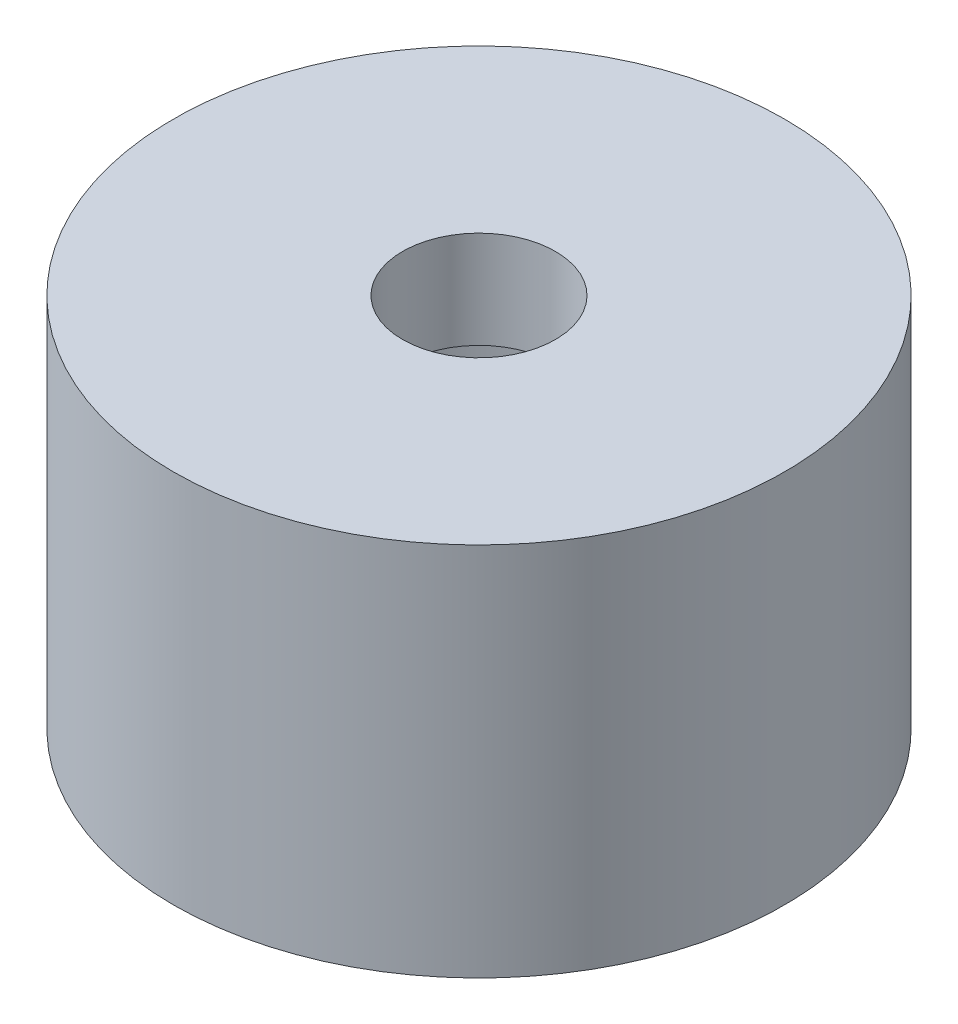
ISO-10303-21;
HEADER;
FILE_DESCRIPTION(('STEP AP214'),'2;1');
FILE_NAME('part.step','',(''),(''),'','','');
FILE_SCHEMA(('AUTOMOTIVE_DESIGN { 1 0 10303 214 1 1 1 1 }'));
ENDSEC;
DATA;
#1=APPLICATION_CONTEXT('core data for automotive mechanical design processes');
#2=APPLICATION_PROTOCOL_DEFINITION('international standard','automotive_design',2000,#1);
#3=PRODUCT_CONTEXT('',#1,'mechanical');
#4=PRODUCT('Part','Part','',(#3));
#5=PRODUCT_RELATED_PRODUCT_CATEGORY('part','',(#4));
#6=PRODUCT_DEFINITION_FORMATION('','',#4);
#7=PRODUCT_DEFINITION_CONTEXT('part definition',#1,'design');
#8=PRODUCT_DEFINITION('design','',#6,#7);
#9=PRODUCT_DEFINITION_SHAPE('','',#8);
#10=(LENGTH_UNIT() NAMED_UNIT(*) SI_UNIT(.MILLI.,.METRE.));
#11=(NAMED_UNIT(*) PLANE_ANGLE_UNIT() SI_UNIT($,.RADIAN.));
#12=(NAMED_UNIT(*) SI_UNIT($,.STERADIAN.) SOLID_ANGLE_UNIT());
#13=UNCERTAINTY_MEASURE_WITH_UNIT(LENGTH_MEASURE(1.E-05),#10,'distance_accuracy_value','');
#14=(GEOMETRIC_REPRESENTATION_CONTEXT(3) GLOBAL_UNCERTAINTY_ASSIGNED_CONTEXT((#13)) GLOBAL_UNIT_ASSIGNED_CONTEXT((#10,
#11,#12)) REPRESENTATION_CONTEXT('',''));
#15=CARTESIAN_POINT('',(0.,0.,0.));
#16=DIRECTION('',(0.,0.,1.));
#17=DIRECTION('',(1.,0.,0.));
#18=AXIS2_PLACEMENT_3D('',#15,#16,#17);
#19=CARTESIAN_POINT('',(0.,0.,0.));
#20=DIRECTION('',(0.,1.,0.));
#21=DIRECTION('',(0.,0.,1.));
#22=AXIS2_PLACEMENT_3D('',#19,#20,#21);
#23=PLANE('',#22);
#24=CARTESIAN_POINT('',(0.,0.,0.));
#25=DIRECTION('',(0.,1.,0.));
#26=DIRECTION('',(0.,0.,1.));
#27=AXIS2_PLACEMENT_3D('',#24,#25,#26);
#28=CIRCLE('',#27,11.);
#29=CARTESIAN_POINT('',(0.,0.,11.));
#30=VERTEX_POINT('',#29);
#31=EDGE_CURVE('E10',#30,#30,#28,.T.);
#32=ORIENTED_EDGE('',*,*,#31,.F.);
#33=EDGE_LOOP('',(#32));
#34=FACE_BOUND('',#33,.T.);
#35=CARTESIAN_POINT('',(0.,0.,0.));
#36=DIRECTION('',(0.,1.,0.));
#37=DIRECTION('',(0.,0.,1.));
#38=AXIS2_PLACEMENT_3D('',#35,#36,#37);
#39=CIRCLE('',#38,7.);
#40=CARTESIAN_POINT('',(0.,0.,7.));
#41=VERTEX_POINT('',#40);
#42=EDGE_CURVE('E38',#41,#41,#39,.T.);
#43=ORIENTED_EDGE('',*,*,#42,.T.);
#44=EDGE_LOOP('',(#43));
#45=FACE_BOUND('',#44,.T.);
#46=ADVANCED_FACE('F31',(#34,#45),#23,.F.);
#47=CARTESIAN_POINT('',(0.,10.,0.));
#48=DIRECTION('',(0.,-1.,0.));
#49=DIRECTION('',(0.,0.,-1.));
#50=AXIS2_PLACEMENT_3D('',#47,#48,#49);
#51=CYLINDRICAL_SURFACE('',#50,11.);
#52=ORIENTED_EDGE('',*,*,#31,.T.);
#53=EDGE_LOOP('',(#52));
#54=FACE_BOUND('',#53,.T.);
#55=CARTESIAN_POINT('',(0.,13.5,0.));
#56=DIRECTION('',(0.,1.,0.));
#57=DIRECTION('',(0.,0.,1.));
#58=AXIS2_PLACEMENT_3D('',#55,#56,#57);
#59=CIRCLE('',#58,11.);
#60=CARTESIAN_POINT('',(0.,13.5,11.));
#61=VERTEX_POINT('',#60);
#62=EDGE_CURVE('E46',#61,#61,#59,.T.);
#63=ORIENTED_EDGE('',*,*,#62,.F.);
#64=EDGE_LOOP('',(#63));
#65=FACE_BOUND('',#64,.T.);
#66=ADVANCED_FACE('F33',(#54,#65),#51,.T.);
#67=CARTESIAN_POINT('',(0.,10.,0.));
#68=DIRECTION('',(0.,-1.,0.));
#69=DIRECTION('',(0.,0.,-1.));
#70=AXIS2_PLACEMENT_3D('',#67,#68,#69);
#71=CYLINDRICAL_SURFACE('',#70,7.);
#72=CARTESIAN_POINT('',(0.,10.,0.));
#73=DIRECTION('',(0.,1.,0.));
#74=DIRECTION('',(0.,0.,1.));
#75=AXIS2_PLACEMENT_3D('',#72,#73,#74);
#76=CIRCLE('',#75,7.);
#77=CARTESIAN_POINT('',(0.,10.,7.));
#78=VERTEX_POINT('',#77);
#79=EDGE_CURVE('E42',#78,#78,#76,.T.);
#80=ORIENTED_EDGE('',*,*,#79,.T.);
#81=EDGE_LOOP('',(#80));
#82=FACE_BOUND('',#81,.T.);
#83=ORIENTED_EDGE('',*,*,#42,.F.);
#84=EDGE_LOOP('',(#83));
#85=FACE_BOUND('',#84,.T.);
#86=ADVANCED_FACE('F71',(#82,#85),#71,.F.);
#87=CARTESIAN_POINT('',(0.,10.,0.));
#88=DIRECTION('',(0.,1.,0.));
#89=DIRECTION('',(0.,0.,1.));
#90=AXIS2_PLACEMENT_3D('',#87,#88,#89);
#91=PLANE('',#90);
#92=CARTESIAN_POINT('',(0.,10.,0.));
#93=DIRECTION('',(0.,1.,0.));
#94=DIRECTION('',(0.,0.,1.));
#95=AXIS2_PLACEMENT_3D('',#92,#93,#94);
#96=CIRCLE('',#95,2.75);
#97=CARTESIAN_POINT('',(0.,10.,2.75));
#98=VERTEX_POINT('',#97);
#99=EDGE_CURVE('E52',#98,#98,#96,.T.);
#100=ORIENTED_EDGE('',*,*,#99,.T.);
#101=EDGE_LOOP('',(#100));
#102=FACE_BOUND('',#101,.T.);
#103=ORIENTED_EDGE('',*,*,#79,.F.);
#104=EDGE_LOOP('',(#103));
#105=FACE_BOUND('',#104,.T.);
#106=ADVANCED_FACE('F63',(#102,#105),#91,.F.);
#107=CARTESIAN_POINT('',(0.,13.5,0.));
#108=DIRECTION('',(0.,1.,0.));
#109=DIRECTION('',(0.,0.,1.));
#110=AXIS2_PLACEMENT_3D('',#107,#108,#109);
#111=PLANE('',#110);
#112=ORIENTED_EDGE('',*,*,#62,.T.);
#113=EDGE_LOOP('',(#112));
#114=FACE_BOUND('',#113,.T.);
#115=CARTESIAN_POINT('',(0.,13.5,0.));
#116=DIRECTION('',(0.,1.,0.));
#117=DIRECTION('',(0.,0.,1.));
#118=AXIS2_PLACEMENT_3D('',#115,#116,#117);
#119=CIRCLE('',#118,2.75);
#120=CARTESIAN_POINT('',(0.,13.5,2.75));
#121=VERTEX_POINT('',#120);
#122=EDGE_CURVE('E51',#121,#121,#119,.T.);
#123=ORIENTED_EDGE('',*,*,#122,.F.);
#124=EDGE_LOOP('',(#123));
#125=FACE_BOUND('',#124,.T.);
#126=ADVANCED_FACE('F61',(#114,#125),#111,.T.);
#127=CARTESIAN_POINT('',(0.,13.5,0.));
#128=DIRECTION('',(0.,-1.,0.));
#129=DIRECTION('',(0.,0.,-1.));
#130=AXIS2_PLACEMENT_3D('',#127,#128,#129);
#131=CYLINDRICAL_SURFACE('',#130,2.75);
#132=ORIENTED_EDGE('',*,*,#122,.T.);
#133=EDGE_LOOP('',(#132));
#134=FACE_BOUND('',#133,.T.);
#135=ORIENTED_EDGE('',*,*,#99,.F.);
#136=EDGE_LOOP('',(#135));
#137=FACE_BOUND('',#136,.T.);
#138=ADVANCED_FACE('F58',(#134,#137),#131,.F.);
#139=CLOSED_SHELL('',(#46,#66,#86,#106,#126,#138));
#140=MANIFOLD_SOLID_BREP('B2',#139);
#141=ADVANCED_BREP_SHAPE_REPRESENTATION('',(#18,#140),#14);
#142=SHAPE_DEFINITION_REPRESENTATION(#9,#141);
ENDSEC;
END-ISO-10303-21;
